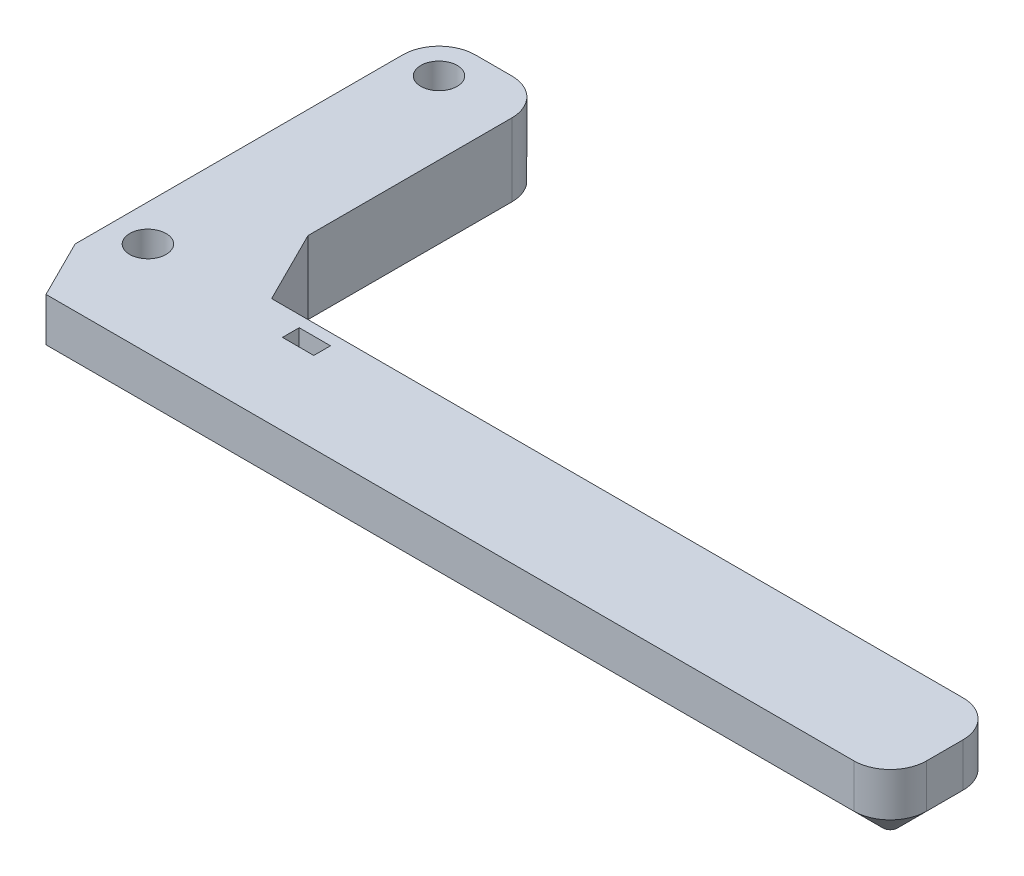
ISO-10303-21;
HEADER;
FILE_DESCRIPTION(('STEP AP214'),'2;1');
FILE_NAME('part.step','',(''),(''),'','','');
FILE_SCHEMA(('AUTOMOTIVE_DESIGN { 1 0 10303 214 1 1 1 1 }'));
ENDSEC;
DATA;
#1=APPLICATION_CONTEXT('core data for automotive mechanical design processes');
#2=APPLICATION_PROTOCOL_DEFINITION('international standard','automotive_design',2000,#1);
#3=PRODUCT_CONTEXT('',#1,'mechanical');
#4=PRODUCT('Part','Part','',(#3));
#5=PRODUCT_RELATED_PRODUCT_CATEGORY('part','',(#4));
#6=PRODUCT_DEFINITION_FORMATION('','',#4);
#7=PRODUCT_DEFINITION_CONTEXT('part definition',#1,'design');
#8=PRODUCT_DEFINITION('design','',#6,#7);
#9=PRODUCT_DEFINITION_SHAPE('','',#8);
#10=(LENGTH_UNIT() NAMED_UNIT(*) SI_UNIT(.MILLI.,.METRE.));
#11=(NAMED_UNIT(*) PLANE_ANGLE_UNIT() SI_UNIT($,.RADIAN.));
#12=(NAMED_UNIT(*) SI_UNIT($,.STERADIAN.) SOLID_ANGLE_UNIT());
#13=UNCERTAINTY_MEASURE_WITH_UNIT(LENGTH_MEASURE(1.E-05),#10,'distance_accuracy_value','');
#14=(GEOMETRIC_REPRESENTATION_CONTEXT(3) GLOBAL_UNCERTAINTY_ASSIGNED_CONTEXT((#13)) GLOBAL_UNIT_ASSIGNED_CONTEXT((#10,
#11,#12)) REPRESENTATION_CONTEXT('',''));
#15=CARTESIAN_POINT('',(0.,0.,0.));
#16=DIRECTION('',(0.,0.,1.));
#17=DIRECTION('',(1.,0.,0.));
#18=AXIS2_PLACEMENT_3D('',#15,#16,#17);
#19=CARTESIAN_POINT('',(0.,0.,0.));
#20=DIRECTION('',(0.,1.,0.));
#21=DIRECTION('',(0.,0.,1.));
#22=AXIS2_PLACEMENT_3D('',#19,#20,#21);
#23=PLANE('',#22);
#24=CARTESIAN_POINT('',(115.,0.,28.));
#25=DIRECTION('',(0.,1.,0.));
#26=DIRECTION('',(0.,0.,1.));
#27=AXIS2_PLACEMENT_3D('',#24,#25,#26);
#28=CIRCLE('',#27,0.99999999999997);
#29=CARTESIAN_POINT('',(116.,0.,28.));
#30=VERTEX_POINT('',#29);
#31=CARTESIAN_POINT('',(115.,0.,29.));
#32=VERTEX_POINT('',#31);
#33=EDGE_CURVE('E442',#30,#32,#28,.F.);
#34=ORIENTED_EDGE('',*,*,#33,.T.);
#35=DIRECTION('',(-1.,0.,0.));
#36=VECTOR('',#35,1.);
#37=CARTESIAN_POINT('',(0.,0.,29.));
#38=LINE('',#37,#36);
#39=CARTESIAN_POINT('',(14.,0.,29.));
#40=VERTEX_POINT('',#39);
#41=EDGE_CURVE('E445',#32,#40,#38,.T.);
#42=ORIENTED_EDGE('',*,*,#41,.T.);
#43=DIRECTION('',(0.,0.,1.));
#44=VECTOR('',#43,1.);
#45=CARTESIAN_POINT('',(14.,0.,-25.));
#46=LINE('',#45,#44);
#47=CARTESIAN_POINT('',(14.,0.,-23.));
#48=VERTEX_POINT('',#47);
#49=EDGE_CURVE('E474',#48,#40,#46,.T.);
#50=ORIENTED_EDGE('',*,*,#49,.F.);
#51=CARTESIAN_POINT('',(9.99999999999999,0.,-20.));
#52=DIRECTION('',(0.,1.,0.));
#53=DIRECTION('',(0.,0.,1.));
#54=AXIS2_PLACEMENT_3D('',#51,#52,#53);
#55=CIRCLE('',#54,5.);
#56=CARTESIAN_POINT('',(15.,0.,-20.));
#57=VERTEX_POINT('',#56);
#58=EDGE_CURVE('E385',#48,#57,#55,.F.);
#59=ORIENTED_EDGE('',*,*,#58,.T.);
#60=DIRECTION('',(0.,0.,-1.));
#61=VECTOR('',#60,1.);
#62=CARTESIAN_POINT('',(15.,0.,-25.));
#63=LINE('',#62,#61);
#64=CARTESIAN_POINT('',(15.,0.,8.));
#65=VERTEX_POINT('',#64);
#66=EDGE_CURVE('E356',#65,#57,#63,.T.);
#67=ORIENTED_EDGE('',*,*,#66,.F.);
#68=DIRECTION('',(-0.447213595499958,0.,-0.894427190999916));
#69=VECTOR('',#68,1.);
#70=CARTESIAN_POINT('',(15.,0.,8.));
#71=LINE('',#70,#69);
#72=CARTESIAN_POINT('',(22.,0.,22.));
#73=VERTEX_POINT('',#72);
#74=EDGE_CURVE('E234',#73,#65,#71,.T.);
#75=ORIENTED_EDGE('',*,*,#74,.F.);
#76=DIRECTION('',(1.,0.,0.));
#77=VECTOR('',#76,1.);
#78=CARTESIAN_POINT('',(0.,0.,22.));
#79=LINE('',#78,#77);
#80=CARTESIAN_POINT('',(115.,0.,22.0000000000001));
#81=VERTEX_POINT('',#80);
#82=EDGE_CURVE('E433',#73,#81,#79,.T.);
#83=ORIENTED_EDGE('',*,*,#82,.T.);
#84=CARTESIAN_POINT('',(115.,0.,23.));
#85=DIRECTION('',(0.,1.,0.));
#86=DIRECTION('',(0.,0.,1.));
#87=AXIS2_PLACEMENT_3D('',#84,#85,#86);
#88=CIRCLE('',#87,0.999999999999973);
#89=CARTESIAN_POINT('',(116.,0.,23.));
#90=VERTEX_POINT('',#89);
#91=EDGE_CURVE('E436',#81,#90,#88,.F.);
#92=ORIENTED_EDGE('',*,*,#91,.T.);
#93=DIRECTION('',(0.,0.,1.));
#94=VECTOR('',#93,1.);
#95=CARTESIAN_POINT('',(116.,0.,0.));
#96=LINE('',#95,#94);
#97=EDGE_CURVE('E439',#90,#30,#96,.T.);
#98=ORIENTED_EDGE('',*,*,#97,.T.);
#99=EDGE_LOOP('',(#34,#42,#50,#59,#67,#75,#83,#92,#98));
#100=FACE_BOUND('',#99,.T.);
#101=ADVANCED_FACE('F47',(#100),#23,.F.);
#102=CARTESIAN_POINT('',(0.,10.,0.));
#103=DIRECTION('',(0.,1.,0.));
#104=DIRECTION('',(0.,0.,1.));
#105=AXIS2_PLACEMENT_3D('',#102,#103,#104);
#106=PLANE('',#105);
#107=CARTESIAN_POINT('',(5.,10.,-20.));
#108=DIRECTION('',(0.,1.,0.));
#109=DIRECTION('',(0.,0.,1.));
#110=AXIS2_PLACEMENT_3D('',#107,#108,#109);
#111=CIRCLE('',#110,2.5);
#112=CARTESIAN_POINT('',(5.,10.,-17.5));
#113=VERTEX_POINT('',#112);
#114=EDGE_CURVE('E235',#113,#113,#111,.T.);
#115=ORIENTED_EDGE('',*,*,#114,.F.);
#116=EDGE_LOOP('',(#115));
#117=FACE_BOUND('',#116,.T.);
#118=DIRECTION('',(1.,0.,0.));
#119=VECTOR('',#118,1.);
#120=CARTESIAN_POINT('',(4.,10.,33.));
#121=LINE('',#120,#119);
#122=CARTESIAN_POINT('',(4.,10.,33.));
#123=VERTEX_POINT('',#122);
#124=CARTESIAN_POINT('',(115.,10.,33.));
#125=VERTEX_POINT('',#124);
#126=EDGE_CURVE('E328',#123,#125,#121,.T.);
#127=ORIENTED_EDGE('',*,*,#126,.T.);
#128=CARTESIAN_POINT('',(115.,10.,28.));
#129=DIRECTION('',(0.,1.,0.));
#130=DIRECTION('',(0.,0.,1.));
#131=AXIS2_PLACEMENT_3D('',#128,#129,#130);
#132=CIRCLE('',#131,5.);
#133=CARTESIAN_POINT('',(120.,10.,28.));
#134=VERTEX_POINT('',#133);
#135=EDGE_CURVE('E400',#125,#134,#132,.T.);
#136=ORIENTED_EDGE('',*,*,#135,.T.);
#137=DIRECTION('',(0.,0.,-1.));
#138=VECTOR('',#137,1.);
#139=CARTESIAN_POINT('',(120.,10.,33.));
#140=LINE('',#139,#138);
#141=CARTESIAN_POINT('',(120.,10.,23.));
#142=VERTEX_POINT('',#141);
#143=EDGE_CURVE('E333',#134,#142,#140,.T.);
#144=ORIENTED_EDGE('',*,*,#143,.T.);
#145=CARTESIAN_POINT('',(115.,10.,23.));
#146=DIRECTION('',(0.,1.,0.));
#147=DIRECTION('',(0.,0.,1.));
#148=AXIS2_PLACEMENT_3D('',#145,#146,#147);
#149=CIRCLE('',#148,5.);
#150=CARTESIAN_POINT('',(115.,10.,18.));
#151=VERTEX_POINT('',#150);
#152=EDGE_CURVE('E397',#142,#151,#149,.T.);
#153=ORIENTED_EDGE('',*,*,#152,.T.);
#154=DIRECTION('',(-1.,0.,0.));
#155=VECTOR('',#154,1.);
#156=CARTESIAN_POINT('',(120.,10.,18.));
#157=LINE('',#156,#155);
#158=CARTESIAN_POINT('',(20.,10.,18.));
#159=VERTEX_POINT('',#158);
#160=EDGE_CURVE('E337',#151,#159,#157,.T.);
#161=ORIENTED_EDGE('',*,*,#160,.T.);
#162=DIRECTION('',(-0.447213595499958,0.,-0.894427190999916));
#163=VECTOR('',#162,1.);
#164=CARTESIAN_POINT('',(15.,10.,8.));
#165=LINE('',#164,#163);
#166=CARTESIAN_POINT('',(15.,10.,8.));
#167=VERTEX_POINT('',#166);
#168=EDGE_CURVE('E340',#159,#167,#165,.T.);
#169=ORIENTED_EDGE('',*,*,#168,.T.);
#170=DIRECTION('',(0.,0.,-1.));
#171=VECTOR('',#170,1.);
#172=CARTESIAN_POINT('',(15.,10.,-25.));
#173=LINE('',#172,#171);
#174=CARTESIAN_POINT('',(15.,10.,-20.));
#175=VERTEX_POINT('',#174);
#176=EDGE_CURVE('E343',#167,#175,#173,.T.);
#177=ORIENTED_EDGE('',*,*,#176,.T.);
#178=CARTESIAN_POINT('',(9.99999999999999,10.,-20.));
#179=DIRECTION('',(0.,1.,0.));
#180=DIRECTION('',(0.,0.,1.));
#181=AXIS2_PLACEMENT_3D('',#178,#179,#180);
#182=CIRCLE('',#181,5.);
#183=CARTESIAN_POINT('',(9.99999999999999,10.,-25.));
#184=VERTEX_POINT('',#183);
#185=EDGE_CURVE('E391',#175,#184,#182,.T.);
#186=ORIENTED_EDGE('',*,*,#185,.T.);
#187=DIRECTION('',(-1.,0.,0.));
#188=VECTOR('',#187,1.);
#189=CARTESIAN_POINT('',(0.,10.,-25.));
#190=LINE('',#189,#188);
#191=CARTESIAN_POINT('',(4.99999999999999,10.,-25.));
#192=VERTEX_POINT('',#191);
#193=EDGE_CURVE('E347',#184,#192,#190,.T.);
#194=ORIENTED_EDGE('',*,*,#193,.T.);
#195=CARTESIAN_POINT('',(4.99999999999999,10.,-20.));
#196=DIRECTION('',(0.,1.,0.));
#197=DIRECTION('',(0.,0.,1.));
#198=AXIS2_PLACEMENT_3D('',#195,#196,#197);
#199=CIRCLE('',#198,5.);
#200=CARTESIAN_POINT('',(0.,10.,-20.));
#201=VERTEX_POINT('',#200);
#202=EDGE_CURVE('E394',#192,#201,#199,.T.);
#203=ORIENTED_EDGE('',*,*,#202,.T.);
#204=DIRECTION('',(0.,0.,1.));
#205=VECTOR('',#204,1.);
#206=CARTESIAN_POINT('',(0.,10.,25.));
#207=LINE('',#206,#205);
#208=CARTESIAN_POINT('',(0.,10.,25.));
#209=VERTEX_POINT('',#208);
#210=EDGE_CURVE('E351',#201,#209,#207,.T.);
#211=ORIENTED_EDGE('',*,*,#210,.T.);
#212=DIRECTION('',(0.447213595499958,0.,0.894427190999916));
#213=VECTOR('',#212,1.);
#214=CARTESIAN_POINT('',(0.,10.,25.));
#215=LINE('',#214,#213);
#216=EDGE_CURVE('E324',#209,#123,#215,.T.);
#217=ORIENTED_EDGE('',*,*,#216,.T.);
#218=EDGE_LOOP('',(#127,#136,#144,#153,#161,#169,#177,#186,#194,#203,#211,#217));
#219=FACE_BOUND('',#218,.T.);
#220=CARTESIAN_POINT('',(5.00000000000001,10.,20.));
#221=DIRECTION('',(0.,1.,0.));
#222=DIRECTION('',(0.,0.,1.));
#223=AXIS2_PLACEMENT_3D('',#220,#221,#222);
#224=CIRCLE('',#223,2.5);
#225=CARTESIAN_POINT('',(5.00000000000001,10.,22.5));
#226=VERTEX_POINT('',#225);
#227=EDGE_CURVE('E310',#226,#226,#224,.T.);
#228=ORIENTED_EDGE('',*,*,#227,.F.);
#229=EDGE_LOOP('',(#228));
#230=FACE_BOUND('',#229,.T.);
#231=DIRECTION('',(-1.,0.,0.));
#232=VECTOR('',#231,1.);
#233=CARTESIAN_POINT('',(29.66,10.,19.57));
#234=LINE('',#233,#232);
#235=CARTESIAN_POINT('',(29.66,10.,19.57));
#236=VERTEX_POINT('',#235);
#237=CARTESIAN_POINT('',(25.36,10.,19.57));
#238=VERTEX_POINT('',#237);
#239=EDGE_CURVE('E484',#236,#238,#234,.T.);
#240=ORIENTED_EDGE('',*,*,#239,.F.);
#241=DIRECTION('',(0.,0.,-1.));
#242=VECTOR('',#241,1.);
#243=CARTESIAN_POINT('',(29.66,10.,21.87));
#244=LINE('',#243,#242);
#245=CARTESIAN_POINT('',(29.66,10.,21.87));
#246=VERTEX_POINT('',#245);
#247=EDGE_CURVE('E276',#246,#236,#244,.T.);
#248=ORIENTED_EDGE('',*,*,#247,.F.);
#249=DIRECTION('',(1.,0.,0.));
#250=VECTOR('',#249,1.);
#251=CARTESIAN_POINT('',(25.36,10.,21.87));
#252=LINE('',#251,#250);
#253=CARTESIAN_POINT('',(25.36,10.,21.87));
#254=VERTEX_POINT('',#253);
#255=EDGE_CURVE('E294',#254,#246,#252,.T.);
#256=ORIENTED_EDGE('',*,*,#255,.F.);
#257=DIRECTION('',(0.,0.,1.));
#258=VECTOR('',#257,1.);
#259=CARTESIAN_POINT('',(25.36,10.,19.57));
#260=LINE('',#259,#258);
#261=EDGE_CURVE('E301',#238,#254,#260,.T.);
#262=ORIENTED_EDGE('',*,*,#261,.F.);
#263=EDGE_LOOP('',(#240,#248,#256,#262));
#264=FACE_BOUND('',#263,.T.);
#265=ADVANCED_FACE('F493',(#117,#219,#230,#264),#106,.T.);
#266=CARTESIAN_POINT('',(5.00000000000001,0.,20.));
#267=DIRECTION('',(0.,1.,0.));
#268=DIRECTION('',(0.,0.,1.));
#269=AXIS2_PLACEMENT_3D('',#266,#267,#268);
#270=CIRCLE('',#269,2.5);
#271=CARTESIAN_POINT('',(5.00000000000001,0.,22.5));
#272=VERTEX_POINT('',#271);
#273=EDGE_CURVE('E309',#272,#272,#270,.T.);
#274=ORIENTED_EDGE('',*,*,#273,.T.);
#275=EDGE_LOOP('',(#274));
#276=FACE_BOUND('',#275,.T.);
#277=CARTESIAN_POINT('',(5.,0.,-20.));
#278=DIRECTION('',(0.,1.,0.));
#279=DIRECTION('',(0.,0.,1.));
#280=AXIS2_PLACEMENT_3D('',#277,#278,#279);
#281=CIRCLE('',#280,2.5);
#282=CARTESIAN_POINT('',(5.,0.,-17.5));
#283=VERTEX_POINT('',#282);
#284=EDGE_CURVE('E314',#283,#283,#281,.T.);
#285=ORIENTED_EDGE('',*,*,#284,.T.);
#286=EDGE_LOOP('',(#285));
#287=FACE_BOUND('',#286,.T.);
#288=DIRECTION('',(0.,0.,-1.));
#289=VECTOR('',#288,1.);
#290=CARTESIAN_POINT('',(9.99999999999999,0.,34.3956784204101));
#291=LINE('',#290,#289);
#292=CARTESIAN_POINT('',(9.99999999999999,0.,29.));
#293=VERTEX_POINT('',#292);
#294=CARTESIAN_POINT('',(10.,0.,-25.));
#295=VERTEX_POINT('',#294);
#296=EDGE_CURVE('E100',#293,#295,#291,.T.);
#297=ORIENTED_EDGE('',*,*,#296,.F.);
#298=DIRECTION('',(1.,0.,0.));
#299=VECTOR('',#298,1.);
#300=CARTESIAN_POINT('',(4.,0.,29.));
#301=LINE('',#300,#299);
#302=CARTESIAN_POINT('',(1.99999999999999,0.,29.));
#303=VERTEX_POINT('',#302);
#304=EDGE_CURVE('E212',#293,#303,#301,.F.);
#305=ORIENTED_EDGE('',*,*,#304,.T.);
#306=DIRECTION('',(0.447213595499958,0.,0.894427190999916));
#307=VECTOR('',#306,1.);
#308=CARTESIAN_POINT('',(0.,0.,25.));
#309=LINE('',#308,#307);
#310=CARTESIAN_POINT('',(0.,0.,25.));
#311=VERTEX_POINT('',#310);
#312=EDGE_CURVE('E216',#311,#303,#309,.T.);
#313=ORIENTED_EDGE('',*,*,#312,.F.);
#314=DIRECTION('',(0.,0.,1.));
#315=VECTOR('',#314,1.);
#316=CARTESIAN_POINT('',(0.,0.,25.));
#317=LINE('',#316,#315);
#318=CARTESIAN_POINT('',(0.,0.,-20.));
#319=VERTEX_POINT('',#318);
#320=EDGE_CURVE('E329',#319,#311,#317,.T.);
#321=ORIENTED_EDGE('',*,*,#320,.F.);
#322=CARTESIAN_POINT('',(4.99999999999999,0.,-20.));
#323=DIRECTION('',(0.,1.,0.));
#324=DIRECTION('',(0.,0.,1.));
#325=AXIS2_PLACEMENT_3D('',#322,#323,#324);
#326=CIRCLE('',#325,5.);
#327=CARTESIAN_POINT('',(4.99999999999999,0.,-25.));
#328=VERTEX_POINT('',#327);
#329=EDGE_CURVE('E410',#319,#328,#326,.F.);
#330=ORIENTED_EDGE('',*,*,#329,.T.);
#331=DIRECTION('',(-1.,0.,0.));
#332=VECTOR('',#331,1.);
#333=CARTESIAN_POINT('',(0.,0.,-25.));
#334=LINE('',#333,#332);
#335=EDGE_CURVE('E360',#295,#328,#334,.T.);
#336=ORIENTED_EDGE('',*,*,#335,.F.);
#337=EDGE_LOOP('',(#297,#305,#313,#321,#330,#336));
#338=FACE_BOUND('',#337,.T.);
#339=ADVANCED_FACE('F214',(#276,#287,#338),#23,.F.);
#340=CARTESIAN_POINT('',(0.,10.,25.));
#341=DIRECTION('',(0.894427190999916,0.,-0.447213595499958));
#342=DIRECTION('',(-0.447213595499958,0.,-0.894427190999916));
#343=AXIS2_PLACEMENT_3D('',#340,#341,#342);
#344=PLANE('',#343);
#345=ORIENTED_EDGE('',*,*,#312,.T.);
#346=DIRECTION('',(-0.333333333333334,-0.666666666666665,-0.666666666666668));
#347=VECTOR('',#346,1.);
#348=CARTESIAN_POINT('',(4.,4.00000000000002,33.));
#349=LINE('',#348,#347);
#350=CARTESIAN_POINT('',(4.,4.00000000000002,33.));
#351=VERTEX_POINT('',#350);
#352=EDGE_CURVE('E222',#303,#351,#349,.F.);
#353=ORIENTED_EDGE('',*,*,#352,.T.);
#354=DIRECTION('',(0.,-1.,0.));
#355=VECTOR('',#354,1.);
#356=CARTESIAN_POINT('',(4.,10.,33.));
#357=LINE('',#356,#355);
#358=EDGE_CURVE('E375',#123,#351,#357,.T.);
#359=ORIENTED_EDGE('',*,*,#358,.F.);
#360=ORIENTED_EDGE('',*,*,#216,.F.);
#361=DIRECTION('',(0.,-1.,0.));
#362=VECTOR('',#361,1.);
#363=CARTESIAN_POINT('',(0.,10.,25.));
#364=LINE('',#363,#362);
#365=EDGE_CURVE('E232',#209,#311,#364,.T.);
#366=ORIENTED_EDGE('',*,*,#365,.T.);
#367=EDGE_LOOP('',(#345,#353,#359,#360,#366));
#368=FACE_BOUND('',#367,.T.);
#369=ADVANCED_FACE('F227',(#368),#344,.F.);
#370=CARTESIAN_POINT('',(4.,10.,33.));
#371=DIRECTION('',(0.,0.,-1.));
#372=DIRECTION('',(-1.,0.,0.));
#373=AXIS2_PLACEMENT_3D('',#370,#371,#372);
#374=PLANE('',#373);
#375=ORIENTED_EDGE('',*,*,#358,.T.);
#376=DIRECTION('',(1.,0.,0.));
#377=VECTOR('',#376,1.);
#378=CARTESIAN_POINT('',(4.,4.00000000000002,33.));
#379=LINE('',#378,#377);
#380=CARTESIAN_POINT('',(115.,4.00000000000002,33.));
#381=VERTEX_POINT('',#380);
#382=EDGE_CURVE('E240',#351,#381,#379,.T.);
#383=ORIENTED_EDGE('',*,*,#382,.T.);
#384=DIRECTION('',(0.,-1.,0.));
#385=VECTOR('',#384,1.);
#386=CARTESIAN_POINT('',(115.,10.,33.));
#387=LINE('',#386,#385);
#388=EDGE_CURVE('E388',#381,#125,#387,.F.);
#389=ORIENTED_EDGE('',*,*,#388,.T.);
#390=ORIENTED_EDGE('',*,*,#126,.F.);
#391=EDGE_LOOP('',(#375,#383,#389,#390));
#392=FACE_BOUND('',#391,.T.);
#393=ADVANCED_FACE('F519',(#392),#374,.F.);
#394=CARTESIAN_POINT('',(120.,10.,33.));
#395=DIRECTION('',(-1.,0.,0.));
#396=DIRECTION('',(0.,0.,1.));
#397=AXIS2_PLACEMENT_3D('',#394,#395,#396);
#398=PLANE('',#397);
#399=DIRECTION('',(0.,-1.,0.));
#400=VECTOR('',#399,1.);
#401=CARTESIAN_POINT('',(120.,10.,28.));
#402=LINE('',#401,#400);
#403=CARTESIAN_POINT('',(120.,4.00000000000002,28.));
#404=VERTEX_POINT('',#403);
#405=EDGE_CURVE('E381',#134,#404,#402,.T.);
#406=ORIENTED_EDGE('',*,*,#405,.T.);
#407=DIRECTION('',(0.,0.,-1.));
#408=VECTOR('',#407,1.);
#409=CARTESIAN_POINT('',(120.,4.00000000000002,33.));
#410=LINE('',#409,#408);
#411=CARTESIAN_POINT('',(120.,4.00000000000002,23.));
#412=VERTEX_POINT('',#411);
#413=EDGE_CURVE('E429',#404,#412,#410,.T.);
#414=ORIENTED_EDGE('',*,*,#413,.T.);
#415=DIRECTION('',(0.,-1.,0.));
#416=VECTOR('',#415,1.);
#417=CARTESIAN_POINT('',(120.,10.,23.));
#418=LINE('',#417,#416);
#419=EDGE_CURVE('E378',#412,#142,#418,.F.);
#420=ORIENTED_EDGE('',*,*,#419,.T.);
#421=ORIENTED_EDGE('',*,*,#143,.F.);
#422=EDGE_LOOP('',(#406,#414,#420,#421));
#423=FACE_BOUND('',#422,.T.);
#424=ADVANCED_FACE('F553',(#423),#398,.F.);
#425=CARTESIAN_POINT('',(20.,10.,18.));
#426=DIRECTION('',(0.,0.,1.));
#427=DIRECTION('',(1.,0.,0.));
#428=AXIS2_PLACEMENT_3D('',#425,#426,#427);
#429=PLANE('',#428);
#430=DIRECTION('',(0.,-1.,0.));
#431=VECTOR('',#430,1.);
#432=CARTESIAN_POINT('',(115.,10.,18.));
#433=LINE('',#432,#431);
#434=CARTESIAN_POINT('',(115.,4.00000000000002,18.));
#435=VERTEX_POINT('',#434);
#436=EDGE_CURVE('E403',#151,#435,#433,.T.);
#437=ORIENTED_EDGE('',*,*,#436,.T.);
#438=DIRECTION('',(-1.,0.,0.));
#439=VECTOR('',#438,1.);
#440=CARTESIAN_POINT('',(20.,4.00000000000002,18.));
#441=LINE('',#440,#439);
#442=CARTESIAN_POINT('',(20.,4.00000000000002,18.));
#443=VERTEX_POINT('',#442);
#444=EDGE_CURVE('E59',#435,#443,#441,.T.);
#445=ORIENTED_EDGE('',*,*,#444,.T.);
#446=DIRECTION('',(0.,-1.,0.));
#447=VECTOR('',#446,1.);
#448=CARTESIAN_POINT('',(20.,10.,18.));
#449=LINE('',#448,#447);
#450=EDGE_CURVE('E372',#159,#443,#449,.T.);
#451=ORIENTED_EDGE('',*,*,#450,.F.);
#452=ORIENTED_EDGE('',*,*,#160,.F.);
#453=EDGE_LOOP('',(#437,#445,#451,#452));
#454=FACE_BOUND('',#453,.T.);
#455=ADVANCED_FACE('F573',(#454),#429,.F.);
#456=CARTESIAN_POINT('',(15.,10.,8.));
#457=DIRECTION('',(-0.894427190999916,0.,0.447213595499958));
#458=DIRECTION('',(0.447213595499958,0.,0.894427190999916));
#459=AXIS2_PLACEMENT_3D('',#456,#457,#458);
#460=PLANE('',#459);
#461=ORIENTED_EDGE('',*,*,#74,.T.);
#462=DIRECTION('',(0.,-1.,0.));
#463=VECTOR('',#462,1.);
#464=CARTESIAN_POINT('',(15.,10.,8.));
#465=LINE('',#464,#463);
#466=EDGE_CURVE('E368',#167,#65,#465,.T.);
#467=ORIENTED_EDGE('',*,*,#466,.F.);
#468=ORIENTED_EDGE('',*,*,#168,.F.);
#469=ORIENTED_EDGE('',*,*,#450,.T.);
#470=DIRECTION('',(-0.333333333333334,0.666666666666665,-0.666666666666668));
#471=VECTOR('',#470,1.);
#472=CARTESIAN_POINT('',(15.8888888888889,12.2222222222222,9.77777777777777));
#473=LINE('',#472,#471);
#474=EDGE_CURVE('E11',#443,#73,#473,.F.);
#475=ORIENTED_EDGE('',*,*,#474,.T.);
#476=EDGE_LOOP('',(#461,#467,#468,#469,#475));
#477=FACE_BOUND('',#476,.T.);
#478=ADVANCED_FACE('F578',(#477),#460,.F.);
#479=CARTESIAN_POINT('',(15.,10.,-25.));
#480=DIRECTION('',(-1.,0.,0.));
#481=DIRECTION('',(0.,0.,1.));
#482=AXIS2_PLACEMENT_3D('',#479,#480,#481);
#483=PLANE('',#482);
#484=ORIENTED_EDGE('',*,*,#66,.T.);
#485=DIRECTION('',(0.,-1.,0.));
#486=VECTOR('',#485,1.);
#487=CARTESIAN_POINT('',(15.,10.,-20.));
#488=LINE('',#487,#486);
#489=EDGE_CURVE('E426',#57,#175,#488,.F.);
#490=ORIENTED_EDGE('',*,*,#489,.T.);
#491=ORIENTED_EDGE('',*,*,#176,.F.);
#492=ORIENTED_EDGE('',*,*,#466,.T.);
#493=EDGE_LOOP('',(#484,#490,#491,#492));
#494=FACE_BOUND('',#493,.T.);
#495=ADVANCED_FACE('F719',(#494),#483,.F.);
#496=CARTESIAN_POINT('',(0.,10.,-25.));
#497=DIRECTION('',(0.,0.,1.));
#498=DIRECTION('',(1.,0.,0.));
#499=AXIS2_PLACEMENT_3D('',#496,#497,#498);
#500=PLANE('',#499);
#501=ORIENTED_EDGE('',*,*,#335,.T.);
#502=DIRECTION('',(0.,-1.,0.));
#503=VECTOR('',#502,1.);
#504=CARTESIAN_POINT('',(4.99999999999999,10.,-25.));
#505=LINE('',#504,#503);
#506=EDGE_CURVE('E417',#328,#192,#505,.F.);
#507=ORIENTED_EDGE('',*,*,#506,.T.);
#508=ORIENTED_EDGE('',*,*,#193,.F.);
#509=DIRECTION('',(0.,-1.,0.));
#510=VECTOR('',#509,1.);
#511=CARTESIAN_POINT('',(9.99999999999999,10.,-25.));
#512=LINE('',#511,#510);
#513=CARTESIAN_POINT('',(9.99999999999999,3.,-25.));
#514=VERTEX_POINT('',#513);
#515=EDGE_CURVE('E413',#184,#514,#512,.T.);
#516=ORIENTED_EDGE('',*,*,#515,.T.);
#517=DIRECTION('',(0.,-1.,0.));
#518=VECTOR('',#517,1.);
#519=CARTESIAN_POINT('',(10.,3.,-25.));
#520=LINE('',#519,#518);
#521=EDGE_CURVE('E272',#514,#295,#520,.T.);
#522=ORIENTED_EDGE('',*,*,#521,.T.);
#523=EDGE_LOOP('',(#501,#507,#508,#516,#522));
#524=FACE_BOUND('',#523,.T.);
#525=ADVANCED_FACE('F536',(#524),#500,.F.);
#526=CARTESIAN_POINT('',(0.,10.,25.));
#527=DIRECTION('',(1.,0.,0.));
#528=DIRECTION('',(0.,0.,-1.));
#529=AXIS2_PLACEMENT_3D('',#526,#527,#528);
#530=PLANE('',#529);
#531=ORIENTED_EDGE('',*,*,#210,.F.);
#532=DIRECTION('',(0.,-1.,0.));
#533=VECTOR('',#532,1.);
#534=CARTESIAN_POINT('',(0.,10.,-20.));
#535=LINE('',#534,#533);
#536=EDGE_CURVE('E406',#201,#319,#535,.T.);
#537=ORIENTED_EDGE('',*,*,#536,.T.);
#538=ORIENTED_EDGE('',*,*,#320,.T.);
#539=ORIENTED_EDGE('',*,*,#365,.F.);
#540=EDGE_LOOP('',(#531,#537,#538,#539));
#541=FACE_BOUND('',#540,.T.);
#542=ADVANCED_FACE('F527',(#541),#530,.F.);
#543=CARTESIAN_POINT('',(5.,10.,-20.));
#544=DIRECTION('',(0.,-1.,0.));
#545=DIRECTION('',(0.,0.,-1.));
#546=AXIS2_PLACEMENT_3D('',#543,#544,#545);
#547=CYLINDRICAL_SURFACE('',#546,2.5);
#548=ORIENTED_EDGE('',*,*,#114,.T.);
#549=EDGE_LOOP('',(#548));
#550=FACE_BOUND('',#549,.T.);
#551=ORIENTED_EDGE('',*,*,#284,.F.);
#552=EDGE_LOOP('',(#551));
#553=FACE_BOUND('',#552,.T.);
#554=ADVANCED_FACE('F525',(#550,#553),#547,.F.);
#555=CARTESIAN_POINT('',(5.00000000000001,10.,20.));
#556=DIRECTION('',(0.,-1.,0.));
#557=DIRECTION('',(0.,0.,-1.));
#558=AXIS2_PLACEMENT_3D('',#555,#556,#557);
#559=CYLINDRICAL_SURFACE('',#558,2.5);
#560=ORIENTED_EDGE('',*,*,#227,.T.);
#561=EDGE_LOOP('',(#560));
#562=FACE_BOUND('',#561,.T.);
#563=ORIENTED_EDGE('',*,*,#273,.F.);
#564=EDGE_LOOP('',(#563));
#565=FACE_BOUND('',#564,.T.);
#566=ADVANCED_FACE('F502',(#562,#565),#559,.F.);
#567=CARTESIAN_POINT('',(29.66,10.,21.87));
#568=DIRECTION('',(-1.,0.,0.));
#569=DIRECTION('',(0.,0.,1.));
#570=AXIS2_PLACEMENT_3D('',#567,#568,#569);
#571=PLANE('',#570);
#572=DIRECTION('',(0.,-0.707106781186546,0.707106781186549));
#573=VECTOR('',#572,1.);
#574=CARTESIAN_POINT('',(29.66,4.00000000000002,18.));
#575=LINE('',#574,#573);
#576=CARTESIAN_POINT('',(29.66,0.130000000000026,21.87));
#577=VERTEX_POINT('',#576);
#578=CARTESIAN_POINT('',(29.66,2.43000000000002,19.57));
#579=VERTEX_POINT('',#578);
#580=EDGE_CURVE('E268',#577,#579,#575,.F.);
#581=ORIENTED_EDGE('',*,*,#580,.F.);
#582=DIRECTION('',(0.,-1.,0.));
#583=VECTOR('',#582,1.);
#584=CARTESIAN_POINT('',(29.66,10.,21.87));
#585=LINE('',#584,#583);
#586=EDGE_CURVE('E288',#246,#577,#585,.T.);
#587=ORIENTED_EDGE('',*,*,#586,.F.);
#588=ORIENTED_EDGE('',*,*,#247,.T.);
#589=DIRECTION('',(0.,-1.,0.));
#590=VECTOR('',#589,1.);
#591=CARTESIAN_POINT('',(29.66,10.,19.57));
#592=LINE('',#591,#590);
#593=EDGE_CURVE('E290',#236,#579,#592,.T.);
#594=ORIENTED_EDGE('',*,*,#593,.T.);
#595=EDGE_LOOP('',(#581,#587,#588,#594));
#596=FACE_BOUND('',#595,.T.);
#597=ADVANCED_FACE('F287',(#596),#571,.T.);
#598=CARTESIAN_POINT('',(29.66,10.,19.57));
#599=DIRECTION('',(0.,0.,1.));
#600=DIRECTION('',(1.,0.,0.));
#601=AXIS2_PLACEMENT_3D('',#598,#599,#600);
#602=PLANE('',#601);
#603=DIRECTION('',(1.,0.,0.));
#604=VECTOR('',#603,1.);
#605=CARTESIAN_POINT('',(20.,2.43000000000002,19.57));
#606=LINE('',#605,#604);
#607=CARTESIAN_POINT('',(25.36,2.43000000000002,19.57));
#608=VERTEX_POINT('',#607);
#609=EDGE_CURVE('E52',#579,#608,#606,.F.);
#610=ORIENTED_EDGE('',*,*,#609,.F.);
#611=ORIENTED_EDGE('',*,*,#593,.F.);
#612=ORIENTED_EDGE('',*,*,#239,.T.);
#613=DIRECTION('',(0.,-1.,0.));
#614=VECTOR('',#613,1.);
#615=CARTESIAN_POINT('',(25.36,10.,19.57));
#616=LINE('',#615,#614);
#617=EDGE_CURVE('E88',#238,#608,#616,.T.);
#618=ORIENTED_EDGE('',*,*,#617,.T.);
#619=EDGE_LOOP('',(#610,#611,#612,#618));
#620=FACE_BOUND('',#619,.T.);
#621=ADVANCED_FACE('F494',(#620),#602,.T.);
#622=CARTESIAN_POINT('',(25.36,10.,19.57));
#623=DIRECTION('',(1.,0.,0.));
#624=DIRECTION('',(0.,0.,-1.));
#625=AXIS2_PLACEMENT_3D('',#622,#623,#624);
#626=PLANE('',#625);
#627=DIRECTION('',(0.,0.707106781186546,-0.707106781186549));
#628=VECTOR('',#627,1.);
#629=CARTESIAN_POINT('',(25.36,4.00000000000002,18.));
#630=LINE('',#629,#628);
#631=CARTESIAN_POINT('',(25.36,0.130000000000026,21.87));
#632=VERTEX_POINT('',#631);
#633=EDGE_CURVE('E277',#608,#632,#630,.F.);
#634=ORIENTED_EDGE('',*,*,#633,.F.);
#635=ORIENTED_EDGE('',*,*,#617,.F.);
#636=ORIENTED_EDGE('',*,*,#261,.T.);
#637=DIRECTION('',(0.,-1.,0.));
#638=VECTOR('',#637,1.);
#639=CARTESIAN_POINT('',(25.36,10.,21.87));
#640=LINE('',#639,#638);
#641=EDGE_CURVE('E296',#254,#632,#640,.T.);
#642=ORIENTED_EDGE('',*,*,#641,.T.);
#643=EDGE_LOOP('',(#634,#635,#636,#642));
#644=FACE_BOUND('',#643,.T.);
#645=ADVANCED_FACE('F490',(#644),#626,.T.);
#646=CARTESIAN_POINT('',(25.36,10.,21.87));
#647=DIRECTION('',(0.,0.,-1.));
#648=DIRECTION('',(-1.,0.,0.));
#649=AXIS2_PLACEMENT_3D('',#646,#647,#648);
#650=PLANE('',#649);
#651=DIRECTION('',(-1.,0.,0.));
#652=VECTOR('',#651,1.);
#653=CARTESIAN_POINT('',(20.,0.130000000000024,21.87));
#654=LINE('',#653,#652);
#655=EDGE_CURVE('E273',#632,#577,#654,.F.);
#656=ORIENTED_EDGE('',*,*,#655,.F.);
#657=ORIENTED_EDGE('',*,*,#641,.F.);
#658=ORIENTED_EDGE('',*,*,#255,.T.);
#659=ORIENTED_EDGE('',*,*,#586,.T.);
#660=EDGE_LOOP('',(#656,#657,#658,#659));
#661=FACE_BOUND('',#660,.T.);
#662=ADVANCED_FACE('F292',(#661),#650,.T.);
#663=CARTESIAN_POINT('',(14.,3.,-25.));
#664=DIRECTION('',(1.,0.,0.));
#665=DIRECTION('',(0.,0.,-1.));
#666=AXIS2_PLACEMENT_3D('',#663,#664,#665);
#667=PLANE('',#666);
#668=ORIENTED_EDGE('',*,*,#49,.T.);
#669=DIRECTION('',(0.,-0.707106781186546,-0.707106781186549));
#670=VECTOR('',#669,1.);
#671=CARTESIAN_POINT('',(14.,4.00000000000002,33.));
#672=LINE('',#671,#670);
#673=CARTESIAN_POINT('',(14.,3.,32.));
#674=VERTEX_POINT('',#673);
#675=EDGE_CURVE('E450',#40,#674,#672,.F.);
#676=ORIENTED_EDGE('',*,*,#675,.T.);
#677=DIRECTION('',(0.,0.,1.));
#678=VECTOR('',#677,1.);
#679=CARTESIAN_POINT('',(14.,3.,-25.));
#680=LINE('',#679,#678);
#681=CARTESIAN_POINT('',(14.,3.,-23.));
#682=VERTEX_POINT('',#681);
#683=EDGE_CURVE('E466',#682,#674,#680,.T.);
#684=ORIENTED_EDGE('',*,*,#683,.F.);
#685=DIRECTION('',(0.,-1.,0.));
#686=VECTOR('',#685,1.);
#687=CARTESIAN_POINT('',(14.,3.,-23.));
#688=LINE('',#687,#686);
#689=EDGE_CURVE('E423',#682,#48,#688,.T.);
#690=ORIENTED_EDGE('',*,*,#689,.T.);
#691=EDGE_LOOP('',(#668,#676,#684,#690));
#692=FACE_BOUND('',#691,.T.);
#693=ADVANCED_FACE('F661',(#692),#667,.F.);
#694=CARTESIAN_POINT('',(9.99999999999999,3.,34.3956784204101));
#695=DIRECTION('',(-1.,0.,0.));
#696=DIRECTION('',(0.,0.,1.));
#697=AXIS2_PLACEMENT_3D('',#694,#695,#696);
#698=PLANE('',#697);
#699=DIRECTION('',(0.,0.,-1.));
#700=VECTOR('',#699,1.);
#701=CARTESIAN_POINT('',(9.99999999999999,3.,34.3956784204101));
#702=LINE('',#701,#700);
#703=CARTESIAN_POINT('',(9.99999999999999,3.,32.));
#704=VERTEX_POINT('',#703);
#705=EDGE_CURVE('E458',#704,#514,#702,.T.);
#706=ORIENTED_EDGE('',*,*,#705,.F.);
#707=DIRECTION('',(0.,0.707106781186546,0.707106781186549));
#708=VECTOR('',#707,1.);
#709=CARTESIAN_POINT('',(9.99999999999999,4.00000000000002,33.));
#710=LINE('',#709,#708);
#711=EDGE_CURVE('E223',#704,#293,#710,.F.);
#712=ORIENTED_EDGE('',*,*,#711,.T.);
#713=ORIENTED_EDGE('',*,*,#296,.T.);
#714=ORIENTED_EDGE('',*,*,#521,.F.);
#715=EDGE_LOOP('',(#706,#712,#713,#714));
#716=FACE_BOUND('',#715,.T.);
#717=ADVANCED_FACE('F457',(#716),#698,.F.);
#718=CARTESIAN_POINT('',(0.,3.,0.));
#719=DIRECTION('',(0.,-1.,0.));
#720=DIRECTION('',(0.,0.,-1.));
#721=AXIS2_PLACEMENT_3D('',#718,#719,#720);
#722=PLANE('',#721);
#723=ORIENTED_EDGE('',*,*,#683,.T.);
#724=DIRECTION('',(1.,0.,0.));
#725=VECTOR('',#724,1.);
#726=CARTESIAN_POINT('',(0.,3.,32.));
#727=LINE('',#726,#725);
#728=EDGE_CURVE('E453',#674,#704,#727,.F.);
#729=ORIENTED_EDGE('',*,*,#728,.T.);
#730=ORIENTED_EDGE('',*,*,#705,.T.);
#731=CARTESIAN_POINT('',(9.99999999999999,3.,-20.));
#732=DIRECTION('',(0.,-1.,0.));
#733=DIRECTION('',(0.,0.,-1.));
#734=AXIS2_PLACEMENT_3D('',#731,#732,#733);
#735=CIRCLE('',#734,5.);
#736=EDGE_CURVE('E420',#514,#682,#735,.T.);
#737=ORIENTED_EDGE('',*,*,#736,.T.);
#738=EDGE_LOOP('',(#723,#729,#730,#737));
#739=FACE_BOUND('',#738,.T.);
#740=ADVANCED_FACE('F463',(#739),#722,.T.);
#741=CARTESIAN_POINT('',(115.,10.,28.));
#742=DIRECTION('',(0.,-1.,0.));
#743=DIRECTION('',(0.,0.,-1.));
#744=AXIS2_PLACEMENT_3D('',#741,#742,#743);
#745=CYLINDRICAL_SURFACE('',#744,5.);
#746=ORIENTED_EDGE('',*,*,#388,.F.);
#747=CARTESIAN_POINT('',(115.,4.00000000000002,28.));
#748=DIRECTION('',(0.,1.,0.));
#749=DIRECTION('',(0.,0.,1.));
#750=AXIS2_PLACEMENT_3D('',#747,#748,#749);
#751=CIRCLE('',#750,5.);
#752=EDGE_CURVE('E242',#381,#404,#751,.T.);
#753=ORIENTED_EDGE('',*,*,#752,.T.);
#754=ORIENTED_EDGE('',*,*,#405,.F.);
#755=ORIENTED_EDGE('',*,*,#135,.F.);
#756=EDGE_LOOP('',(#746,#753,#754,#755));
#757=FACE_BOUND('',#756,.T.);
#758=ADVANCED_FACE('F549',(#757),#745,.T.);
#759=CARTESIAN_POINT('',(115.,10.,23.));
#760=DIRECTION('',(0.,-1.,0.));
#761=DIRECTION('',(0.,0.,-1.));
#762=AXIS2_PLACEMENT_3D('',#759,#760,#761);
#763=CYLINDRICAL_SURFACE('',#762,5.);
#764=ORIENTED_EDGE('',*,*,#419,.F.);
#765=CARTESIAN_POINT('',(115.,4.00000000000002,23.));
#766=DIRECTION('',(0.,1.,0.));
#767=DIRECTION('',(0.,0.,1.));
#768=AXIS2_PLACEMENT_3D('',#765,#766,#767);
#769=CIRCLE('',#768,5.);
#770=EDGE_CURVE('E245',#412,#435,#769,.T.);
#771=ORIENTED_EDGE('',*,*,#770,.T.);
#772=ORIENTED_EDGE('',*,*,#436,.F.);
#773=ORIENTED_EDGE('',*,*,#152,.F.);
#774=EDGE_LOOP('',(#764,#771,#772,#773));
#775=FACE_BOUND('',#774,.T.);
#776=ADVANCED_FACE('F570',(#775),#763,.T.);
#777=CARTESIAN_POINT('',(4.99999999999999,10.,-20.));
#778=DIRECTION('',(0.,-1.,0.));
#779=DIRECTION('',(0.,0.,-1.));
#780=AXIS2_PLACEMENT_3D('',#777,#778,#779);
#781=CYLINDRICAL_SURFACE('',#780,5.);
#782=ORIENTED_EDGE('',*,*,#202,.F.);
#783=ORIENTED_EDGE('',*,*,#506,.F.);
#784=ORIENTED_EDGE('',*,*,#329,.F.);
#785=ORIENTED_EDGE('',*,*,#536,.F.);
#786=EDGE_LOOP('',(#782,#783,#784,#785));
#787=FACE_BOUND('',#786,.T.);
#788=ADVANCED_FACE('F596',(#787),#781,.T.);
#789=CARTESIAN_POINT('',(9.99999999999999,10.,-20.));
#790=DIRECTION('',(0.,-1.,0.));
#791=DIRECTION('',(0.,0.,-1.));
#792=AXIS2_PLACEMENT_3D('',#789,#790,#791);
#793=CYLINDRICAL_SURFACE('',#792,5.);
#794=ORIENTED_EDGE('',*,*,#185,.F.);
#795=ORIENTED_EDGE('',*,*,#489,.F.);
#796=ORIENTED_EDGE('',*,*,#58,.F.);
#797=ORIENTED_EDGE('',*,*,#689,.F.);
#798=ORIENTED_EDGE('',*,*,#736,.F.);
#799=ORIENTED_EDGE('',*,*,#515,.F.);
#800=EDGE_LOOP('',(#794,#795,#796,#797,#798,#799));
#801=FACE_BOUND('',#800,.T.);
#802=ADVANCED_FACE('F588',(#801),#793,.T.);
#803=CARTESIAN_POINT('',(4.,4.00000000000002,33.));
#804=DIRECTION('',(0.,0.707106781186549,-0.707106781186546));
#805=DIRECTION('',(1.,0.,0.));
#806=AXIS2_PLACEMENT_3D('',#803,#804,#805);
#807=PLANE('',#806);
#808=ORIENTED_EDGE('',*,*,#675,.F.);
#809=ORIENTED_EDGE('',*,*,#41,.F.);
#810=DIRECTION('',(0.,-0.707106781186546,-0.707106781186549));
#811=VECTOR('',#810,1.);
#812=CARTESIAN_POINT('',(115.,4.00000000000002,33.));
#813=LINE('',#812,#811);
#814=EDGE_CURVE('E264',#381,#32,#813,.T.);
#815=ORIENTED_EDGE('',*,*,#814,.F.);
#816=ORIENTED_EDGE('',*,*,#382,.F.);
#817=ORIENTED_EDGE('',*,*,#352,.F.);
#818=ORIENTED_EDGE('',*,*,#304,.F.);
#819=ORIENTED_EDGE('',*,*,#711,.F.);
#820=ORIENTED_EDGE('',*,*,#728,.F.);
#821=EDGE_LOOP('',(#808,#809,#815,#816,#817,#818,#819,#820));
#822=FACE_BOUND('',#821,.T.);
#823=ADVANCED_FACE('F50',(#822),#807,.F.);
#824=CARTESIAN_POINT('',(20.,4.00000000000002,18.));
#825=DIRECTION('',(0.,0.707106781186549,0.707106781186546));
#826=DIRECTION('',(-1.,0.,0.));
#827=AXIS2_PLACEMENT_3D('',#824,#825,#826);
#828=PLANE('',#827);
#829=ORIENTED_EDGE('',*,*,#474,.F.);
#830=ORIENTED_EDGE('',*,*,#444,.F.);
#831=DIRECTION('',(0.,0.707106781186547,-0.707106781186548));
#832=VECTOR('',#831,1.);
#833=CARTESIAN_POINT('',(115.,0.,22.0000000000001));
#834=LINE('',#833,#832);
#835=EDGE_CURVE('E260',#81,#435,#834,.T.);
#836=ORIENTED_EDGE('',*,*,#835,.F.);
#837=ORIENTED_EDGE('',*,*,#82,.F.);
#838=EDGE_LOOP('',(#829,#830,#836,#837));
#839=FACE_BOUND('',#838,.T.);
#840=ORIENTED_EDGE('',*,*,#580,.T.);
#841=ORIENTED_EDGE('',*,*,#609,.T.);
#842=ORIENTED_EDGE('',*,*,#633,.T.);
#843=ORIENTED_EDGE('',*,*,#655,.T.);
#844=EDGE_LOOP('',(#840,#841,#842,#843));
#845=FACE_BOUND('',#844,.T.);
#846=ADVANCED_FACE('F282',(#839,#845),#828,.F.);
#847=CARTESIAN_POINT('',(115.,0.,28.));
#848=DIRECTION('',(0.,1.,0.));
#849=DIRECTION('',(0.,0.,1.));
#850=AXIS2_PLACEMENT_3D('',#847,#848,#849);
#851=CONICAL_SURFACE('',#850,0.99999999999997,0.78539816339745);
#852=ORIENTED_EDGE('',*,*,#814,.T.);
#853=ORIENTED_EDGE('',*,*,#33,.F.);
#854=DIRECTION('',(-0.707106781186549,-0.707106781186546,0.));
#855=VECTOR('',#854,1.);
#856=CARTESIAN_POINT('',(120.,4.00000000000002,28.));
#857=LINE('',#856,#855);
#858=EDGE_CURVE('E256',#404,#30,#857,.T.);
#859=ORIENTED_EDGE('',*,*,#858,.F.);
#860=ORIENTED_EDGE('',*,*,#752,.F.);
#861=EDGE_LOOP('',(#852,#853,#859,#860));
#862=FACE_BOUND('',#861,.T.);
#863=ADVANCED_FACE('F558',(#862),#851,.T.);
#864=CARTESIAN_POINT('',(115.,0.,23.));
#865=DIRECTION('',(0.,1.,0.));
#866=DIRECTION('',(0.,0.,1.));
#867=AXIS2_PLACEMENT_3D('',#864,#865,#866);
#868=CONICAL_SURFACE('',#867,0.999999999999973,0.78539816339745);
#869=ORIENTED_EDGE('',*,*,#835,.T.);
#870=ORIENTED_EDGE('',*,*,#770,.F.);
#871=DIRECTION('',(0.707106781186549,0.707106781186546,0.));
#872=VECTOR('',#871,1.);
#873=CARTESIAN_POINT('',(116.,0.,23.));
#874=LINE('',#873,#872);
#875=EDGE_CURVE('E253',#90,#412,#874,.T.);
#876=ORIENTED_EDGE('',*,*,#875,.F.);
#877=ORIENTED_EDGE('',*,*,#91,.F.);
#878=EDGE_LOOP('',(#869,#870,#876,#877));
#879=FACE_BOUND('',#878,.T.);
#880=ADVANCED_FACE('F566',(#879),#868,.T.);
#881=CARTESIAN_POINT('',(120.,4.00000000000002,33.));
#882=DIRECTION('',(-0.707106781186546,0.707106781186549,0.));
#883=DIRECTION('',(0.,0.,-1.));
#884=AXIS2_PLACEMENT_3D('',#881,#882,#883);
#885=PLANE('',#884);
#886=ORIENTED_EDGE('',*,*,#858,.T.);
#887=ORIENTED_EDGE('',*,*,#97,.F.);
#888=ORIENTED_EDGE('',*,*,#875,.T.);
#889=ORIENTED_EDGE('',*,*,#413,.F.);
#890=EDGE_LOOP('',(#886,#887,#888,#889));
#891=FACE_BOUND('',#890,.T.);
#892=ADVANCED_FACE('F561',(#891),#885,.F.);
#893=CLOSED_SHELL('',(#101,#265,#339,#369,#393,#424,#455,#478,#495,#525,#542,#554,#566,#597,
#621,#645,#662,#693,#717,#740,#758,#776,#788,#802,#823,#846,#863,#880,#892));
#894=MANIFOLD_SOLID_BREP('B2',#893);
#895=ADVANCED_BREP_SHAPE_REPRESENTATION('',(#18,#894),#14);
#896=SHAPE_DEFINITION_REPRESENTATION(#9,#895);
ENDSEC;
END-ISO-10303-21;
